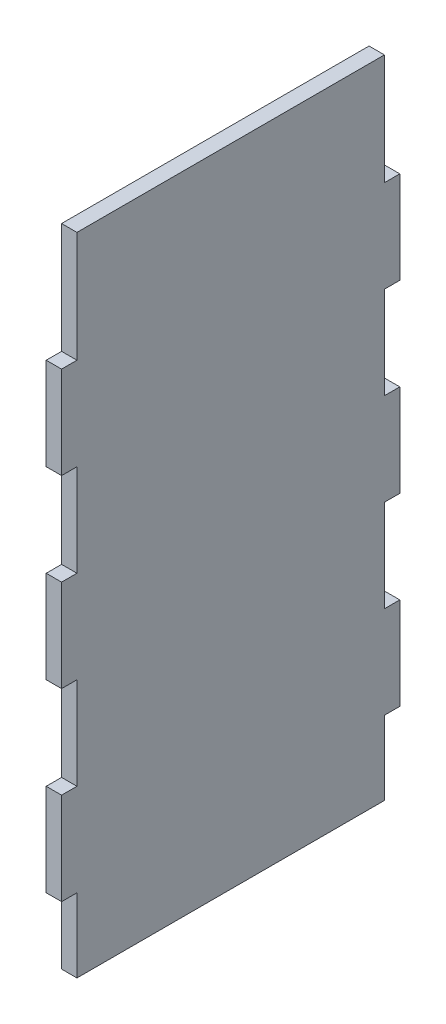
ISO-10303-21;
HEADER;
FILE_DESCRIPTION(('STEP AP214'),'2;1');
FILE_NAME('part.step','',(''),(''),'','','');
FILE_SCHEMA(('AUTOMOTIVE_DESIGN { 1 0 10303 214 1 1 1 1 }'));
ENDSEC;
DATA;
#1=APPLICATION_CONTEXT('core data for automotive mechanical design processes');
#2=APPLICATION_PROTOCOL_DEFINITION('international standard','automotive_design',2000,#1);
#3=PRODUCT_CONTEXT('',#1,'mechanical');
#4=PRODUCT('Part','Part','',(#3));
#5=PRODUCT_RELATED_PRODUCT_CATEGORY('part','',(#4));
#6=PRODUCT_DEFINITION_FORMATION('','',#4);
#7=PRODUCT_DEFINITION_CONTEXT('part definition',#1,'design');
#8=PRODUCT_DEFINITION('design','',#6,#7);
#9=PRODUCT_DEFINITION_SHAPE('','',#8);
#10=(LENGTH_UNIT() NAMED_UNIT(*) SI_UNIT(.MILLI.,.METRE.));
#11=(NAMED_UNIT(*) PLANE_ANGLE_UNIT() SI_UNIT($,.RADIAN.));
#12=(NAMED_UNIT(*) SI_UNIT($,.STERADIAN.) SOLID_ANGLE_UNIT());
#13=UNCERTAINTY_MEASURE_WITH_UNIT(LENGTH_MEASURE(1.E-05),#10,'distance_accuracy_value','');
#14=(GEOMETRIC_REPRESENTATION_CONTEXT(3) GLOBAL_UNCERTAINTY_ASSIGNED_CONTEXT((#13)) GLOBAL_UNIT_ASSIGNED_CONTEXT((#10,
#11,#12)) REPRESENTATION_CONTEXT('',''));
#15=CARTESIAN_POINT('',(0.,0.,0.));
#16=DIRECTION('',(0.,0.,1.));
#17=DIRECTION('',(1.,0.,0.));
#18=AXIS2_PLACEMENT_3D('',#15,#16,#17);
#19=CARTESIAN_POINT('',(3.175,0.,0.));
#20=DIRECTION('',(0.,0.,1.));
#21=DIRECTION('',(0.,-1.,0.));
#22=AXIS2_PLACEMENT_3D('',#19,#20,#21);
#23=PLANE('',#22);
#24=DIRECTION('',(0.,1.,0.));
#25=VECTOR('',#24,1.);
#26=CARTESIAN_POINT('',(0.,0.,0.));
#27=LINE('',#26,#25);
#28=CARTESIAN_POINT('',(0.,0.,0.));
#29=VERTEX_POINT('',#28);
#30=CARTESIAN_POINT('',(0.,15.24,-7.9815263405954E-13));
#31=VERTEX_POINT('',#30);
#32=EDGE_CURVE('E249',#29,#31,#27,.T.);
#33=ORIENTED_EDGE('',*,*,#32,.T.);
#34=DIRECTION('',(-1.,0.,0.));
#35=VECTOR('',#34,1.);
#36=CARTESIAN_POINT('',(3.175,15.24,-7.9815263405954E-13));
#37=LINE('',#36,#35);
#38=CARTESIAN_POINT('',(3.175,15.24,-7.9815263405954E-13));
#39=VERTEX_POINT('',#38);
#40=EDGE_CURVE('E11',#39,#31,#37,.T.);
#41=ORIENTED_EDGE('',*,*,#40,.F.);
#42=DIRECTION('',(0.,1.,0.));
#43=VECTOR('',#42,1.);
#44=CARTESIAN_POINT('',(3.175,0.,0.));
#45=LINE('',#44,#43);
#46=CARTESIAN_POINT('',(3.175,0.,0.));
#47=VERTEX_POINT('',#46);
#48=EDGE_CURVE('E303',#47,#39,#45,.T.);
#49=ORIENTED_EDGE('',*,*,#48,.F.);
#50=DIRECTION('',(-1.,0.,0.));
#51=VECTOR('',#50,1.);
#52=CARTESIAN_POINT('',(3.175,0.,0.));
#53=LINE('',#52,#51);
#54=EDGE_CURVE('E245',#47,#29,#53,.T.);
#55=ORIENTED_EDGE('',*,*,#54,.T.);
#56=EDGE_LOOP('',(#33,#41,#49,#55));
#57=FACE_BOUND('',#56,.T.);
#58=ADVANCED_FACE('F33',(#57),#23,.F.);
#59=CARTESIAN_POINT('',(3.175,15.24,-3.1750000000008));
#60=DIRECTION('',(0.,1.,0.));
#61=DIRECTION('',(0.,0.,1.));
#62=AXIS2_PLACEMENT_3D('',#59,#60,#61);
#63=PLANE('',#62);
#64=DIRECTION('',(0.,0.,-1.));
#65=VECTOR('',#64,1.);
#66=CARTESIAN_POINT('',(0.,15.24,-3.1750000000008));
#67=LINE('',#66,#65);
#68=CARTESIAN_POINT('',(0.,15.24,-3.1750000000008));
#69=VERTEX_POINT('',#68);
#70=EDGE_CURVE('E252',#31,#69,#67,.T.);
#71=ORIENTED_EDGE('',*,*,#70,.T.);
#72=DIRECTION('',(-1.,0.,0.));
#73=VECTOR('',#72,1.);
#74=CARTESIAN_POINT('',(3.175,15.24,-3.1750000000008));
#75=LINE('',#74,#73);
#76=CARTESIAN_POINT('',(3.175,15.24,-3.1750000000008));
#77=VERTEX_POINT('',#76);
#78=EDGE_CURVE('E41',#77,#69,#75,.T.);
#79=ORIENTED_EDGE('',*,*,#78,.F.);
#80=DIRECTION('',(0.,0.,-1.));
#81=VECTOR('',#80,1.);
#82=CARTESIAN_POINT('',(3.175,15.24,-3.1750000000008));
#83=LINE('',#82,#81);
#84=EDGE_CURVE('E152',#39,#77,#83,.T.);
#85=ORIENTED_EDGE('',*,*,#84,.F.);
#86=ORIENTED_EDGE('',*,*,#40,.T.);
#87=EDGE_LOOP('',(#71,#79,#85,#86));
#88=FACE_BOUND('',#87,.T.);
#89=ADVANCED_FACE('F461',(#88),#63,.F.);
#90=CARTESIAN_POINT('',(3.175,34.29,-3.1750000000008));
#91=DIRECTION('',(0.,0.,1.));
#92=DIRECTION('',(0.,-1.,0.));
#93=AXIS2_PLACEMENT_3D('',#90,#91,#92);
#94=PLANE('',#93);
#95=DIRECTION('',(0.,1.,0.));
#96=VECTOR('',#95,1.);
#97=CARTESIAN_POINT('',(0.,34.29,-3.1750000000008));
#98=LINE('',#97,#96);
#99=CARTESIAN_POINT('',(0.,34.29,-3.1750000000008));
#100=VERTEX_POINT('',#99);
#101=EDGE_CURVE('E254',#69,#100,#98,.T.);
#102=ORIENTED_EDGE('',*,*,#101,.T.);
#103=DIRECTION('',(-1.,0.,0.));
#104=VECTOR('',#103,1.);
#105=CARTESIAN_POINT('',(3.175,34.29,-3.1750000000008));
#106=LINE('',#105,#104);
#107=CARTESIAN_POINT('',(3.175,34.29,-3.1750000000008));
#108=VERTEX_POINT('',#107);
#109=EDGE_CURVE('E370',#108,#100,#106,.T.);
#110=ORIENTED_EDGE('',*,*,#109,.F.);
#111=DIRECTION('',(0.,1.,0.));
#112=VECTOR('',#111,1.);
#113=CARTESIAN_POINT('',(3.175,34.29,-3.1750000000008));
#114=LINE('',#113,#112);
#115=EDGE_CURVE('E378',#77,#108,#114,.T.);
#116=ORIENTED_EDGE('',*,*,#115,.F.);
#117=ORIENTED_EDGE('',*,*,#78,.T.);
#118=EDGE_LOOP('',(#102,#110,#116,#117));
#119=FACE_BOUND('',#118,.T.);
#120=ADVANCED_FACE('F376',(#119),#94,.F.);
#121=CARTESIAN_POINT('',(3.175,34.29,-7.9815263405954E-13));
#122=DIRECTION('',(0.,-1.,0.));
#123=DIRECTION('',(0.,0.,-1.));
#124=AXIS2_PLACEMENT_3D('',#121,#122,#123);
#125=PLANE('',#124);
#126=DIRECTION('',(0.,0.,1.));
#127=VECTOR('',#126,1.);
#128=CARTESIAN_POINT('',(0.,34.29,-7.9815263405954E-13));
#129=LINE('',#128,#127);
#130=CARTESIAN_POINT('',(0.,34.29,-7.9815263405954E-13));
#131=VERTEX_POINT('',#130);
#132=EDGE_CURVE('E256',#100,#131,#129,.T.);
#133=ORIENTED_EDGE('',*,*,#132,.T.);
#134=DIRECTION('',(-1.,0.,0.));
#135=VECTOR('',#134,1.);
#136=CARTESIAN_POINT('',(3.175,34.29,-7.9815263405954E-13));
#137=LINE('',#136,#135);
#138=CARTESIAN_POINT('',(3.175,34.29,-7.9815263405954E-13));
#139=VERTEX_POINT('',#138);
#140=EDGE_CURVE('E367',#139,#131,#137,.T.);
#141=ORIENTED_EDGE('',*,*,#140,.F.);
#142=DIRECTION('',(0.,0.,1.));
#143=VECTOR('',#142,1.);
#144=CARTESIAN_POINT('',(3.175,34.29,-7.9815263405954E-13));
#145=LINE('',#144,#143);
#146=EDGE_CURVE('E396',#108,#139,#145,.T.);
#147=ORIENTED_EDGE('',*,*,#146,.F.);
#148=ORIENTED_EDGE('',*,*,#109,.T.);
#149=EDGE_LOOP('',(#133,#141,#147,#148));
#150=FACE_BOUND('',#149,.T.);
#151=ADVANCED_FACE('F387',(#150),#125,.F.);
#152=CARTESIAN_POINT('',(3.175,34.29,-7.9815263405954E-13));
#153=DIRECTION('',(0.,0.,1.));
#154=DIRECTION('',(0.,-1.,0.));
#155=AXIS2_PLACEMENT_3D('',#152,#153,#154);
#156=PLANE('',#155);
#157=DIRECTION('',(0.,1.,0.));
#158=VECTOR('',#157,1.);
#159=CARTESIAN_POINT('',(0.,34.29,-7.9815263405954E-13));
#160=LINE('',#159,#158);
#161=CARTESIAN_POINT('',(0.,53.34,-3.9907631702977E-13));
#162=VERTEX_POINT('',#161);
#163=EDGE_CURVE('E258',#131,#162,#160,.T.);
#164=ORIENTED_EDGE('',*,*,#163,.T.);
#165=DIRECTION('',(-1.,0.,0.));
#166=VECTOR('',#165,1.);
#167=CARTESIAN_POINT('',(3.175,53.34,-3.9907631702977E-13));
#168=LINE('',#167,#166);
#169=CARTESIAN_POINT('',(3.175,53.34,-3.9907631702977E-13));
#170=VERTEX_POINT('',#169);
#171=EDGE_CURVE('E364',#170,#162,#168,.T.);
#172=ORIENTED_EDGE('',*,*,#171,.F.);
#173=DIRECTION('',(0.,1.,0.));
#174=VECTOR('',#173,1.);
#175=CARTESIAN_POINT('',(3.175,34.29,-7.9815263405954E-13));
#176=LINE('',#175,#174);
#177=EDGE_CURVE('E393',#139,#170,#176,.T.);
#178=ORIENTED_EDGE('',*,*,#177,.F.);
#179=ORIENTED_EDGE('',*,*,#140,.T.);
#180=EDGE_LOOP('',(#164,#172,#178,#179));
#181=FACE_BOUND('',#180,.T.);
#182=ADVANCED_FACE('F391',(#181),#156,.F.);
#183=CARTESIAN_POINT('',(3.175,53.34,-3.1750000000004));
#184=DIRECTION('',(0.,1.,0.));
#185=DIRECTION('',(0.,0.,1.));
#186=AXIS2_PLACEMENT_3D('',#183,#184,#185);
#187=PLANE('',#186);
#188=DIRECTION('',(0.,0.,-1.));
#189=VECTOR('',#188,1.);
#190=CARTESIAN_POINT('',(0.,53.34,-3.1750000000004));
#191=LINE('',#190,#189);
#192=CARTESIAN_POINT('',(0.,53.34,-3.1750000000004));
#193=VERTEX_POINT('',#192);
#194=EDGE_CURVE('E260',#162,#193,#191,.T.);
#195=ORIENTED_EDGE('',*,*,#194,.T.);
#196=DIRECTION('',(-1.,0.,0.));
#197=VECTOR('',#196,1.);
#198=CARTESIAN_POINT('',(3.175,53.34,-3.1750000000004));
#199=LINE('',#198,#197);
#200=CARTESIAN_POINT('',(3.175,53.34,-3.1750000000004));
#201=VERTEX_POINT('',#200);
#202=EDGE_CURVE('E361',#201,#193,#199,.T.);
#203=ORIENTED_EDGE('',*,*,#202,.F.);
#204=DIRECTION('',(0.,0.,-1.));
#205=VECTOR('',#204,1.);
#206=CARTESIAN_POINT('',(3.175,53.34,-3.1750000000004));
#207=LINE('',#206,#205);
#208=EDGE_CURVE('E395',#170,#201,#207,.T.);
#209=ORIENTED_EDGE('',*,*,#208,.F.);
#210=ORIENTED_EDGE('',*,*,#171,.T.);
#211=EDGE_LOOP('',(#195,#203,#209,#210));
#212=FACE_BOUND('',#211,.T.);
#213=ADVANCED_FACE('F474',(#212),#187,.F.);
#214=CARTESIAN_POINT('',(3.175,72.39,-3.1750000000004));
#215=DIRECTION('',(0.,0.,1.));
#216=DIRECTION('',(0.,-1.,0.));
#217=AXIS2_PLACEMENT_3D('',#214,#215,#216);
#218=PLANE('',#217);
#219=DIRECTION('',(0.,1.,0.));
#220=VECTOR('',#219,1.);
#221=CARTESIAN_POINT('',(0.,72.39,-3.1750000000004));
#222=LINE('',#221,#220);
#223=CARTESIAN_POINT('',(0.,72.39,-3.1750000000004));
#224=VERTEX_POINT('',#223);
#225=EDGE_CURVE('E262',#193,#224,#222,.T.);
#226=ORIENTED_EDGE('',*,*,#225,.T.);
#227=DIRECTION('',(-1.,0.,0.));
#228=VECTOR('',#227,1.);
#229=CARTESIAN_POINT('',(3.175,72.39,-3.1750000000004));
#230=LINE('',#229,#228);
#231=CARTESIAN_POINT('',(3.175,72.39,-3.1750000000004));
#232=VERTEX_POINT('',#231);
#233=EDGE_CURVE('E358',#232,#224,#230,.T.);
#234=ORIENTED_EDGE('',*,*,#233,.F.);
#235=DIRECTION('',(0.,1.,0.));
#236=VECTOR('',#235,1.);
#237=CARTESIAN_POINT('',(3.175,72.39,-3.1750000000004));
#238=LINE('',#237,#236);
#239=EDGE_CURVE('E398',#201,#232,#238,.T.);
#240=ORIENTED_EDGE('',*,*,#239,.F.);
#241=ORIENTED_EDGE('',*,*,#202,.T.);
#242=EDGE_LOOP('',(#226,#234,#240,#241));
#243=FACE_BOUND('',#242,.T.);
#244=ADVANCED_FACE('F477',(#243),#218,.F.);
#245=CARTESIAN_POINT('',(3.175,72.39,-3.9907631702977E-13));
#246=DIRECTION('',(0.,-1.,0.));
#247=DIRECTION('',(0.,0.,-1.));
#248=AXIS2_PLACEMENT_3D('',#245,#246,#247);
#249=PLANE('',#248);
#250=DIRECTION('',(0.,0.,1.));
#251=VECTOR('',#250,1.);
#252=CARTESIAN_POINT('',(0.,72.39,-3.9907631702977E-13));
#253=LINE('',#252,#251);
#254=CARTESIAN_POINT('',(0.,72.39,-3.9907631702977E-13));
#255=VERTEX_POINT('',#254);
#256=EDGE_CURVE('E264',#224,#255,#253,.T.);
#257=ORIENTED_EDGE('',*,*,#256,.T.);
#258=DIRECTION('',(-1.,0.,0.));
#259=VECTOR('',#258,1.);
#260=CARTESIAN_POINT('',(3.175,72.39,-3.9907631702977E-13));
#261=LINE('',#260,#259);
#262=CARTESIAN_POINT('',(3.175,72.39,-3.9907631702977E-13));
#263=VERTEX_POINT('',#262);
#264=EDGE_CURVE('E355',#263,#255,#261,.T.);
#265=ORIENTED_EDGE('',*,*,#264,.F.);
#266=DIRECTION('',(0.,0.,1.));
#267=VECTOR('',#266,1.);
#268=CARTESIAN_POINT('',(3.175,72.39,-3.9907631702977E-13));
#269=LINE('',#268,#267);
#270=EDGE_CURVE('E404',#232,#263,#269,.T.);
#271=ORIENTED_EDGE('',*,*,#270,.F.);
#272=ORIENTED_EDGE('',*,*,#233,.T.);
#273=EDGE_LOOP('',(#257,#265,#271,#272));
#274=FACE_BOUND('',#273,.T.);
#275=ADVANCED_FACE('F481',(#274),#249,.F.);
#276=CARTESIAN_POINT('',(3.175,72.39,-3.9907631702977E-13));
#277=DIRECTION('',(0.,0.,1.));
#278=DIRECTION('',(0.,-1.,0.));
#279=AXIS2_PLACEMENT_3D('',#276,#277,#278);
#280=PLANE('',#279);
#281=DIRECTION('',(0.,1.,0.));
#282=VECTOR('',#281,1.);
#283=CARTESIAN_POINT('',(0.,72.39,-3.9907631702977E-13));
#284=LINE('',#283,#282);
#285=CARTESIAN_POINT('',(0.,91.44,0.));
#286=VERTEX_POINT('',#285);
#287=EDGE_CURVE('E266',#255,#286,#284,.T.);
#288=ORIENTED_EDGE('',*,*,#287,.T.);
#289=DIRECTION('',(-1.,0.,0.));
#290=VECTOR('',#289,1.);
#291=CARTESIAN_POINT('',(3.175,91.44,0.));
#292=LINE('',#291,#290);
#293=CARTESIAN_POINT('',(3.175,91.44,0.));
#294=VERTEX_POINT('',#293);
#295=EDGE_CURVE('E352',#294,#286,#292,.T.);
#296=ORIENTED_EDGE('',*,*,#295,.F.);
#297=DIRECTION('',(0.,1.,0.));
#298=VECTOR('',#297,1.);
#299=CARTESIAN_POINT('',(3.175,72.39,-3.9907631702977E-13));
#300=LINE('',#299,#298);
#301=EDGE_CURVE('E406',#263,#294,#300,.T.);
#302=ORIENTED_EDGE('',*,*,#301,.F.);
#303=ORIENTED_EDGE('',*,*,#264,.T.);
#304=EDGE_LOOP('',(#288,#296,#302,#303));
#305=FACE_BOUND('',#304,.T.);
#306=ADVANCED_FACE('F485',(#305),#280,.F.);
#307=CARTESIAN_POINT('',(3.175,91.44,-3.175));
#308=DIRECTION('',(0.,1.,0.));
#309=DIRECTION('',(0.,0.,1.));
#310=AXIS2_PLACEMENT_3D('',#307,#308,#309);
#311=PLANE('',#310);
#312=DIRECTION('',(0.,0.,-1.));
#313=VECTOR('',#312,1.);
#314=CARTESIAN_POINT('',(0.,91.44,-3.175));
#315=LINE('',#314,#313);
#316=CARTESIAN_POINT('',(0.,91.44,-3.175));
#317=VERTEX_POINT('',#316);
#318=EDGE_CURVE('E268',#286,#317,#315,.T.);
#319=ORIENTED_EDGE('',*,*,#318,.T.);
#320=DIRECTION('',(-1.,0.,0.));
#321=VECTOR('',#320,1.);
#322=CARTESIAN_POINT('',(3.175,91.44,-3.175));
#323=LINE('',#322,#321);
#324=CARTESIAN_POINT('',(3.175,91.44,-3.175));
#325=VERTEX_POINT('',#324);
#326=EDGE_CURVE('E349',#325,#317,#323,.T.);
#327=ORIENTED_EDGE('',*,*,#326,.F.);
#328=DIRECTION('',(0.,0.,-1.));
#329=VECTOR('',#328,1.);
#330=CARTESIAN_POINT('',(3.175,91.44,-3.175));
#331=LINE('',#330,#329);
#332=EDGE_CURVE('E408',#294,#325,#331,.T.);
#333=ORIENTED_EDGE('',*,*,#332,.F.);
#334=ORIENTED_EDGE('',*,*,#295,.T.);
#335=EDGE_LOOP('',(#319,#327,#333,#334));
#336=FACE_BOUND('',#335,.T.);
#337=ADVANCED_FACE('F489',(#336),#311,.F.);
#338=CARTESIAN_POINT('',(3.175,110.49,-3.175));
#339=DIRECTION('',(0.,0.,1.));
#340=DIRECTION('',(0.,-1.,0.));
#341=AXIS2_PLACEMENT_3D('',#338,#339,#340);
#342=PLANE('',#341);
#343=DIRECTION('',(0.,1.,0.));
#344=VECTOR('',#343,1.);
#345=CARTESIAN_POINT('',(0.,110.49,-3.175));
#346=LINE('',#345,#344);
#347=CARTESIAN_POINT('',(0.,110.49,-3.175));
#348=VERTEX_POINT('',#347);
#349=EDGE_CURVE('E270',#317,#348,#346,.T.);
#350=ORIENTED_EDGE('',*,*,#349,.T.);
#351=DIRECTION('',(-1.,0.,0.));
#352=VECTOR('',#351,1.);
#353=CARTESIAN_POINT('',(3.175,110.49,-3.175));
#354=LINE('',#353,#352);
#355=CARTESIAN_POINT('',(3.175,110.49,-3.175));
#356=VERTEX_POINT('',#355);
#357=EDGE_CURVE('E346',#356,#348,#354,.T.);
#358=ORIENTED_EDGE('',*,*,#357,.F.);
#359=DIRECTION('',(0.,1.,0.));
#360=VECTOR('',#359,1.);
#361=CARTESIAN_POINT('',(3.175,110.49,-3.175));
#362=LINE('',#361,#360);
#363=EDGE_CURVE('E410',#325,#356,#362,.T.);
#364=ORIENTED_EDGE('',*,*,#363,.F.);
#365=ORIENTED_EDGE('',*,*,#326,.T.);
#366=EDGE_LOOP('',(#350,#358,#364,#365));
#367=FACE_BOUND('',#366,.T.);
#368=ADVANCED_FACE('F493',(#367),#342,.F.);
#369=CARTESIAN_POINT('',(3.175,110.49,0.));
#370=DIRECTION('',(0.,-1.,0.));
#371=DIRECTION('',(0.,0.,-1.));
#372=AXIS2_PLACEMENT_3D('',#369,#370,#371);
#373=PLANE('',#372);
#374=DIRECTION('',(0.,0.,1.));
#375=VECTOR('',#374,1.);
#376=CARTESIAN_POINT('',(0.,110.49,0.));
#377=LINE('',#376,#375);
#378=CARTESIAN_POINT('',(0.,110.49,0.));
#379=VERTEX_POINT('',#378);
#380=EDGE_CURVE('E272',#348,#379,#377,.T.);
#381=ORIENTED_EDGE('',*,*,#380,.T.);
#382=DIRECTION('',(-1.,0.,0.));
#383=VECTOR('',#382,1.);
#384=CARTESIAN_POINT('',(3.175,110.49,0.));
#385=LINE('',#384,#383);
#386=CARTESIAN_POINT('',(3.175,110.49,0.));
#387=VERTEX_POINT('',#386);
#388=EDGE_CURVE('E343',#387,#379,#385,.T.);
#389=ORIENTED_EDGE('',*,*,#388,.F.);
#390=DIRECTION('',(0.,0.,1.));
#391=VECTOR('',#390,1.);
#392=CARTESIAN_POINT('',(3.175,110.49,0.));
#393=LINE('',#392,#391);
#394=EDGE_CURVE('E412',#356,#387,#393,.T.);
#395=ORIENTED_EDGE('',*,*,#394,.F.);
#396=ORIENTED_EDGE('',*,*,#357,.T.);
#397=EDGE_LOOP('',(#381,#389,#395,#396));
#398=FACE_BOUND('',#397,.T.);
#399=ADVANCED_FACE('F497',(#398),#373,.F.);
#400=CARTESIAN_POINT('',(3.175,110.49,0.));
#401=DIRECTION('',(0.,0.,1.));
#402=DIRECTION('',(1.,0.,0.));
#403=AXIS2_PLACEMENT_3D('',#400,#401,#402);
#404=PLANE('',#403);
#405=DIRECTION('',(0.,1.,0.));
#406=VECTOR('',#405,1.);
#407=CARTESIAN_POINT('',(0.,110.49,0.));
#408=LINE('',#407,#406);
#409=CARTESIAN_POINT('',(0.,133.35,0.));
#410=VERTEX_POINT('',#409);
#411=EDGE_CURVE('E274',#379,#410,#408,.T.);
#412=ORIENTED_EDGE('',*,*,#411,.T.);
#413=DIRECTION('',(-1.,0.,0.));
#414=VECTOR('',#413,1.);
#415=CARTESIAN_POINT('',(3.175,133.35,0.));
#416=LINE('',#415,#414);
#417=CARTESIAN_POINT('',(3.175,133.35,0.));
#418=VERTEX_POINT('',#417);
#419=EDGE_CURVE('E340',#418,#410,#416,.T.);
#420=ORIENTED_EDGE('',*,*,#419,.F.);
#421=DIRECTION('',(0.,1.,0.));
#422=VECTOR('',#421,1.);
#423=CARTESIAN_POINT('',(3.175,110.49,0.));
#424=LINE('',#423,#422);
#425=EDGE_CURVE('E414',#387,#418,#424,.T.);
#426=ORIENTED_EDGE('',*,*,#425,.F.);
#427=ORIENTED_EDGE('',*,*,#388,.T.);
#428=EDGE_LOOP('',(#412,#420,#426,#427));
#429=FACE_BOUND('',#428,.T.);
#430=ADVANCED_FACE('F501',(#429),#404,.F.);
#431=CARTESIAN_POINT('',(3.175,133.35,0.));
#432=DIRECTION('',(0.,-1.,0.));
#433=DIRECTION('',(0.,0.,-1.));
#434=AXIS2_PLACEMENT_3D('',#431,#432,#433);
#435=PLANE('',#434);
#436=DIRECTION('',(0.,0.,1.));
#437=VECTOR('',#436,1.);
#438=CARTESIAN_POINT('',(0.,133.35,0.));
#439=LINE('',#438,#437);
#440=CARTESIAN_POINT('',(0.,133.35,63.5));
#441=VERTEX_POINT('',#440);
#442=EDGE_CURVE('E276',#410,#441,#439,.T.);
#443=ORIENTED_EDGE('',*,*,#442,.T.);
#444=DIRECTION('',(-1.,0.,0.));
#445=VECTOR('',#444,1.);
#446=CARTESIAN_POINT('',(3.175,133.35,63.5));
#447=LINE('',#446,#445);
#448=CARTESIAN_POINT('',(3.175,133.35,63.5));
#449=VERTEX_POINT('',#448);
#450=EDGE_CURVE('E337',#449,#441,#447,.T.);
#451=ORIENTED_EDGE('',*,*,#450,.F.);
#452=DIRECTION('',(0.,0.,1.));
#453=VECTOR('',#452,1.);
#454=CARTESIAN_POINT('',(3.175,133.35,0.));
#455=LINE('',#454,#453);
#456=EDGE_CURVE('E416',#418,#449,#455,.T.);
#457=ORIENTED_EDGE('',*,*,#456,.F.);
#458=ORIENTED_EDGE('',*,*,#419,.T.);
#459=EDGE_LOOP('',(#443,#451,#457,#458));
#460=FACE_BOUND('',#459,.T.);
#461=ADVANCED_FACE('F505',(#460),#435,.F.);
#462=CARTESIAN_POINT('',(3.175,110.49,63.5));
#463=DIRECTION('',(0.,0.,-1.));
#464=DIRECTION('',(-1.,0.,0.));
#465=AXIS2_PLACEMENT_3D('',#462,#463,#464);
#466=PLANE('',#465);
#467=DIRECTION('',(0.,-1.,0.));
#468=VECTOR('',#467,1.);
#469=CARTESIAN_POINT('',(0.,110.49,63.5));
#470=LINE('',#469,#468);
#471=CARTESIAN_POINT('',(0.,110.49,63.5));
#472=VERTEX_POINT('',#471);
#473=EDGE_CURVE('E278',#441,#472,#470,.T.);
#474=ORIENTED_EDGE('',*,*,#473,.T.);
#475=DIRECTION('',(-1.,0.,0.));
#476=VECTOR('',#475,1.);
#477=CARTESIAN_POINT('',(3.175,110.49,63.5));
#478=LINE('',#477,#476);
#479=CARTESIAN_POINT('',(3.175,110.49,63.5));
#480=VERTEX_POINT('',#479);
#481=EDGE_CURVE('E334',#480,#472,#478,.T.);
#482=ORIENTED_EDGE('',*,*,#481,.F.);
#483=DIRECTION('',(0.,-1.,0.));
#484=VECTOR('',#483,1.);
#485=CARTESIAN_POINT('',(3.175,110.49,63.5));
#486=LINE('',#485,#484);
#487=EDGE_CURVE('E418',#449,#480,#486,.T.);
#488=ORIENTED_EDGE('',*,*,#487,.F.);
#489=ORIENTED_EDGE('',*,*,#450,.T.);
#490=EDGE_LOOP('',(#474,#482,#488,#489));
#491=FACE_BOUND('',#490,.T.);
#492=ADVANCED_FACE('F509',(#491),#466,.F.);
#493=CARTESIAN_POINT('',(3.175,110.49,63.5));
#494=DIRECTION('',(0.,-1.,0.));
#495=DIRECTION('',(0.,0.,-1.));
#496=AXIS2_PLACEMENT_3D('',#493,#494,#495);
#497=PLANE('',#496);
#498=DIRECTION('',(0.,0.,1.));
#499=VECTOR('',#498,1.);
#500=CARTESIAN_POINT('',(0.,110.49,63.5));
#501=LINE('',#500,#499);
#502=CARTESIAN_POINT('',(0.,110.49,66.675));
#503=VERTEX_POINT('',#502);
#504=EDGE_CURVE('E280',#472,#503,#501,.T.);
#505=ORIENTED_EDGE('',*,*,#504,.T.);
#506=DIRECTION('',(-1.,0.,0.));
#507=VECTOR('',#506,1.);
#508=CARTESIAN_POINT('',(3.175,110.49,66.675));
#509=LINE('',#508,#507);
#510=CARTESIAN_POINT('',(3.175,110.49,66.675));
#511=VERTEX_POINT('',#510);
#512=EDGE_CURVE('E331',#511,#503,#509,.T.);
#513=ORIENTED_EDGE('',*,*,#512,.F.);
#514=DIRECTION('',(0.,0.,1.));
#515=VECTOR('',#514,1.);
#516=CARTESIAN_POINT('',(3.175,110.49,63.5));
#517=LINE('',#516,#515);
#518=EDGE_CURVE('E420',#480,#511,#517,.T.);
#519=ORIENTED_EDGE('',*,*,#518,.F.);
#520=ORIENTED_EDGE('',*,*,#481,.T.);
#521=EDGE_LOOP('',(#505,#513,#519,#520));
#522=FACE_BOUND('',#521,.T.);
#523=ADVANCED_FACE('F513',(#522),#497,.F.);
#524=CARTESIAN_POINT('',(3.175,110.49,66.675));
#525=DIRECTION('',(0.,0.,-1.));
#526=DIRECTION('',(-1.,0.,0.));
#527=AXIS2_PLACEMENT_3D('',#524,#525,#526);
#528=PLANE('',#527);
#529=DIRECTION('',(0.,-1.,0.));
#530=VECTOR('',#529,1.);
#531=CARTESIAN_POINT('',(0.,110.49,66.675));
#532=LINE('',#531,#530);
#533=CARTESIAN_POINT('',(0.,91.44,66.675));
#534=VERTEX_POINT('',#533);
#535=EDGE_CURVE('E282',#503,#534,#532,.T.);
#536=ORIENTED_EDGE('',*,*,#535,.T.);
#537=DIRECTION('',(-1.,0.,0.));
#538=VECTOR('',#537,1.);
#539=CARTESIAN_POINT('',(3.175,91.44,66.675));
#540=LINE('',#539,#538);
#541=CARTESIAN_POINT('',(3.175,91.44,66.675));
#542=VERTEX_POINT('',#541);
#543=EDGE_CURVE('E328',#542,#534,#540,.T.);
#544=ORIENTED_EDGE('',*,*,#543,.F.);
#545=DIRECTION('',(0.,-1.,0.));
#546=VECTOR('',#545,1.);
#547=CARTESIAN_POINT('',(3.175,110.49,66.675));
#548=LINE('',#547,#546);
#549=EDGE_CURVE('E422',#511,#542,#548,.T.);
#550=ORIENTED_EDGE('',*,*,#549,.F.);
#551=ORIENTED_EDGE('',*,*,#512,.T.);
#552=EDGE_LOOP('',(#536,#544,#550,#551));
#553=FACE_BOUND('',#552,.T.);
#554=ADVANCED_FACE('F517',(#553),#528,.F.);
#555=CARTESIAN_POINT('',(3.175,91.44,66.675));
#556=DIRECTION('',(0.,1.,0.));
#557=DIRECTION('',(0.,0.,1.));
#558=AXIS2_PLACEMENT_3D('',#555,#556,#557);
#559=PLANE('',#558);
#560=DIRECTION('',(0.,0.,-1.));
#561=VECTOR('',#560,1.);
#562=CARTESIAN_POINT('',(0.,91.44,66.675));
#563=LINE('',#562,#561);
#564=CARTESIAN_POINT('',(0.,91.44,63.5));
#565=VERTEX_POINT('',#564);
#566=EDGE_CURVE('E284',#534,#565,#563,.T.);
#567=ORIENTED_EDGE('',*,*,#566,.T.);
#568=DIRECTION('',(-1.,0.,0.));
#569=VECTOR('',#568,1.);
#570=CARTESIAN_POINT('',(3.175,91.44,63.5));
#571=LINE('',#570,#569);
#572=CARTESIAN_POINT('',(3.175,91.44,63.5));
#573=VERTEX_POINT('',#572);
#574=EDGE_CURVE('E325',#573,#565,#571,.T.);
#575=ORIENTED_EDGE('',*,*,#574,.F.);
#576=DIRECTION('',(0.,0.,-1.));
#577=VECTOR('',#576,1.);
#578=CARTESIAN_POINT('',(3.175,91.44,66.675));
#579=LINE('',#578,#577);
#580=EDGE_CURVE('E424',#542,#573,#579,.T.);
#581=ORIENTED_EDGE('',*,*,#580,.F.);
#582=ORIENTED_EDGE('',*,*,#543,.T.);
#583=EDGE_LOOP('',(#567,#575,#581,#582));
#584=FACE_BOUND('',#583,.T.);
#585=ADVANCED_FACE('F521',(#584),#559,.F.);
#586=CARTESIAN_POINT('',(3.175,72.39,63.5000000000004));
#587=DIRECTION('',(0.,0.,-1.));
#588=DIRECTION('',(0.,1.,0.));
#589=AXIS2_PLACEMENT_3D('',#586,#587,#588);
#590=PLANE('',#589);
#591=DIRECTION('',(0.,-1.,0.));
#592=VECTOR('',#591,1.);
#593=CARTESIAN_POINT('',(0.,72.39,63.5000000000004));
#594=LINE('',#593,#592);
#595=CARTESIAN_POINT('',(0.,72.39,63.5000000000004));
#596=VERTEX_POINT('',#595);
#597=EDGE_CURVE('E286',#565,#596,#594,.T.);
#598=ORIENTED_EDGE('',*,*,#597,.T.);
#599=DIRECTION('',(-1.,0.,0.));
#600=VECTOR('',#599,1.);
#601=CARTESIAN_POINT('',(3.175,72.39,63.5000000000004));
#602=LINE('',#601,#600);
#603=CARTESIAN_POINT('',(3.175,72.39,63.5000000000004));
#604=VERTEX_POINT('',#603);
#605=EDGE_CURVE('E322',#604,#596,#602,.T.);
#606=ORIENTED_EDGE('',*,*,#605,.F.);
#607=DIRECTION('',(0.,-1.,0.));
#608=VECTOR('',#607,1.);
#609=CARTESIAN_POINT('',(3.175,72.39,63.5000000000004));
#610=LINE('',#609,#608);
#611=EDGE_CURVE('E426',#573,#604,#610,.T.);
#612=ORIENTED_EDGE('',*,*,#611,.F.);
#613=ORIENTED_EDGE('',*,*,#574,.T.);
#614=EDGE_LOOP('',(#598,#606,#612,#613));
#615=FACE_BOUND('',#614,.T.);
#616=ADVANCED_FACE('F525',(#615),#590,.F.);
#617=CARTESIAN_POINT('',(3.175,72.39,63.5000000000004));
#618=DIRECTION('',(0.,-1.,0.));
#619=DIRECTION('',(0.,0.,-1.));
#620=AXIS2_PLACEMENT_3D('',#617,#618,#619);
#621=PLANE('',#620);
#622=DIRECTION('',(0.,0.,1.));
#623=VECTOR('',#622,1.);
#624=CARTESIAN_POINT('',(0.,72.39,63.5000000000004));
#625=LINE('',#624,#623);
#626=CARTESIAN_POINT('',(0.,72.39,66.6750000000004));
#627=VERTEX_POINT('',#626);
#628=EDGE_CURVE('E288',#596,#627,#625,.T.);
#629=ORIENTED_EDGE('',*,*,#628,.T.);
#630=DIRECTION('',(-1.,0.,0.));
#631=VECTOR('',#630,1.);
#632=CARTESIAN_POINT('',(3.175,72.39,66.6750000000004));
#633=LINE('',#632,#631);
#634=CARTESIAN_POINT('',(3.175,72.39,66.6750000000004));
#635=VERTEX_POINT('',#634);
#636=EDGE_CURVE('E319',#635,#627,#633,.T.);
#637=ORIENTED_EDGE('',*,*,#636,.F.);
#638=DIRECTION('',(0.,0.,1.));
#639=VECTOR('',#638,1.);
#640=CARTESIAN_POINT('',(3.175,72.39,63.5000000000004));
#641=LINE('',#640,#639);
#642=EDGE_CURVE('E428',#604,#635,#641,.T.);
#643=ORIENTED_EDGE('',*,*,#642,.F.);
#644=ORIENTED_EDGE('',*,*,#605,.T.);
#645=EDGE_LOOP('',(#629,#637,#643,#644));
#646=FACE_BOUND('',#645,.T.);
#647=ADVANCED_FACE('F529',(#646),#621,.F.);
#648=CARTESIAN_POINT('',(3.175,72.39,66.6750000000004));
#649=DIRECTION('',(0.,0.,-1.));
#650=DIRECTION('',(-1.,0.,0.));
#651=AXIS2_PLACEMENT_3D('',#648,#649,#650);
#652=PLANE('',#651);
#653=DIRECTION('',(0.,-1.,0.));
#654=VECTOR('',#653,1.);
#655=CARTESIAN_POINT('',(0.,72.39,66.6750000000004));
#656=LINE('',#655,#654);
#657=CARTESIAN_POINT('',(0.,53.34,66.6750000000004));
#658=VERTEX_POINT('',#657);
#659=EDGE_CURVE('E290',#627,#658,#656,.T.);
#660=ORIENTED_EDGE('',*,*,#659,.T.);
#661=DIRECTION('',(-1.,0.,0.));
#662=VECTOR('',#661,1.);
#663=CARTESIAN_POINT('',(3.175,53.34,66.6750000000004));
#664=LINE('',#663,#662);
#665=CARTESIAN_POINT('',(3.175,53.34,66.6750000000004));
#666=VERTEX_POINT('',#665);
#667=EDGE_CURVE('E316',#666,#658,#664,.T.);
#668=ORIENTED_EDGE('',*,*,#667,.F.);
#669=DIRECTION('',(0.,-1.,0.));
#670=VECTOR('',#669,1.);
#671=CARTESIAN_POINT('',(3.175,72.39,66.6750000000004));
#672=LINE('',#671,#670);
#673=EDGE_CURVE('E430',#635,#666,#672,.T.);
#674=ORIENTED_EDGE('',*,*,#673,.F.);
#675=ORIENTED_EDGE('',*,*,#636,.T.);
#676=EDGE_LOOP('',(#660,#668,#674,#675));
#677=FACE_BOUND('',#676,.T.);
#678=ADVANCED_FACE('F533',(#677),#652,.F.);
#679=CARTESIAN_POINT('',(3.175,53.34,66.6750000000004));
#680=DIRECTION('',(0.,1.,0.));
#681=DIRECTION('',(0.,0.,1.));
#682=AXIS2_PLACEMENT_3D('',#679,#680,#681);
#683=PLANE('',#682);
#684=DIRECTION('',(0.,0.,-1.));
#685=VECTOR('',#684,1.);
#686=CARTESIAN_POINT('',(0.,53.34,66.6750000000004));
#687=LINE('',#686,#685);
#688=CARTESIAN_POINT('',(0.,53.34,63.5000000000004));
#689=VERTEX_POINT('',#688);
#690=EDGE_CURVE('E292',#658,#689,#687,.T.);
#691=ORIENTED_EDGE('',*,*,#690,.T.);
#692=DIRECTION('',(-1.,0.,0.));
#693=VECTOR('',#692,1.);
#694=CARTESIAN_POINT('',(3.175,53.34,63.5000000000004));
#695=LINE('',#694,#693);
#696=CARTESIAN_POINT('',(3.175,53.34,63.5000000000004));
#697=VERTEX_POINT('',#696);
#698=EDGE_CURVE('E313',#697,#689,#695,.T.);
#699=ORIENTED_EDGE('',*,*,#698,.F.);
#700=DIRECTION('',(0.,0.,-1.));
#701=VECTOR('',#700,1.);
#702=CARTESIAN_POINT('',(3.175,53.34,66.6750000000004));
#703=LINE('',#702,#701);
#704=EDGE_CURVE('E432',#666,#697,#703,.T.);
#705=ORIENTED_EDGE('',*,*,#704,.F.);
#706=ORIENTED_EDGE('',*,*,#667,.T.);
#707=EDGE_LOOP('',(#691,#699,#705,#706));
#708=FACE_BOUND('',#707,.T.);
#709=ADVANCED_FACE('F537',(#708),#683,.F.);
#710=CARTESIAN_POINT('',(3.175,34.29,63.5000000000008));
#711=DIRECTION('',(0.,0.,-1.));
#712=DIRECTION('',(0.,1.,0.));
#713=AXIS2_PLACEMENT_3D('',#710,#711,#712);
#714=PLANE('',#713);
#715=DIRECTION('',(0.,-1.,0.));
#716=VECTOR('',#715,1.);
#717=CARTESIAN_POINT('',(0.,34.29,63.5000000000008));
#718=LINE('',#717,#716);
#719=CARTESIAN_POINT('',(0.,34.29,63.5000000000008));
#720=VERTEX_POINT('',#719);
#721=EDGE_CURVE('E294',#689,#720,#718,.T.);
#722=ORIENTED_EDGE('',*,*,#721,.T.);
#723=DIRECTION('',(-1.,0.,0.));
#724=VECTOR('',#723,1.);
#725=CARTESIAN_POINT('',(3.175,34.29,63.5000000000008));
#726=LINE('',#725,#724);
#727=CARTESIAN_POINT('',(3.175,34.29,63.5000000000008));
#728=VERTEX_POINT('',#727);
#729=EDGE_CURVE('E310',#728,#720,#726,.T.);
#730=ORIENTED_EDGE('',*,*,#729,.F.);
#731=DIRECTION('',(0.,-1.,0.));
#732=VECTOR('',#731,1.);
#733=CARTESIAN_POINT('',(3.175,34.29,63.5000000000008));
#734=LINE('',#733,#732);
#735=EDGE_CURVE('E434',#697,#728,#734,.T.);
#736=ORIENTED_EDGE('',*,*,#735,.F.);
#737=ORIENTED_EDGE('',*,*,#698,.T.);
#738=EDGE_LOOP('',(#722,#730,#736,#737));
#739=FACE_BOUND('',#738,.T.);
#740=ADVANCED_FACE('F541',(#739),#714,.F.);
#741=CARTESIAN_POINT('',(3.175,34.29,63.5000000000008));
#742=DIRECTION('',(0.,-1.,0.));
#743=DIRECTION('',(0.,0.,-1.));
#744=AXIS2_PLACEMENT_3D('',#741,#742,#743);
#745=PLANE('',#744);
#746=DIRECTION('',(0.,0.,1.));
#747=VECTOR('',#746,1.);
#748=CARTESIAN_POINT('',(0.,34.29,63.5000000000008));
#749=LINE('',#748,#747);
#750=CARTESIAN_POINT('',(0.,34.29,66.6750000000008));
#751=VERTEX_POINT('',#750);
#752=EDGE_CURVE('E296',#720,#751,#749,.T.);
#753=ORIENTED_EDGE('',*,*,#752,.T.);
#754=DIRECTION('',(-1.,0.,0.));
#755=VECTOR('',#754,1.);
#756=CARTESIAN_POINT('',(3.175,34.29,66.6750000000008));
#757=LINE('',#756,#755);
#758=CARTESIAN_POINT('',(3.175,34.29,66.6750000000008));
#759=VERTEX_POINT('',#758);
#760=EDGE_CURVE('E307',#759,#751,#757,.T.);
#761=ORIENTED_EDGE('',*,*,#760,.F.);
#762=DIRECTION('',(0.,0.,1.));
#763=VECTOR('',#762,1.);
#764=CARTESIAN_POINT('',(3.175,34.29,63.5000000000008));
#765=LINE('',#764,#763);
#766=EDGE_CURVE('E436',#728,#759,#765,.T.);
#767=ORIENTED_EDGE('',*,*,#766,.F.);
#768=ORIENTED_EDGE('',*,*,#729,.T.);
#769=EDGE_LOOP('',(#753,#761,#767,#768));
#770=FACE_BOUND('',#769,.T.);
#771=ADVANCED_FACE('F442',(#770),#745,.F.);
#772=CARTESIAN_POINT('',(3.175,34.29,66.6750000000008));
#773=DIRECTION('',(0.,0.,-1.));
#774=DIRECTION('',(0.,1.,0.));
#775=AXIS2_PLACEMENT_3D('',#772,#773,#774);
#776=PLANE('',#775);
#777=DIRECTION('',(0.,-1.,0.));
#778=VECTOR('',#777,1.);
#779=CARTESIAN_POINT('',(0.,34.29,66.6750000000008));
#780=LINE('',#779,#778);
#781=CARTESIAN_POINT('',(0.,15.24,66.6750000000008));
#782=VERTEX_POINT('',#781);
#783=EDGE_CURVE('E298',#751,#782,#780,.T.);
#784=ORIENTED_EDGE('',*,*,#783,.T.);
#785=DIRECTION('',(-1.,0.,0.));
#786=VECTOR('',#785,1.);
#787=CARTESIAN_POINT('',(3.175,15.24,66.6750000000008));
#788=LINE('',#787,#786);
#789=CARTESIAN_POINT('',(3.175,15.24,66.6750000000008));
#790=VERTEX_POINT('',#789);
#791=EDGE_CURVE('E240',#790,#782,#788,.T.);
#792=ORIENTED_EDGE('',*,*,#791,.F.);
#793=DIRECTION('',(0.,-1.,0.));
#794=VECTOR('',#793,1.);
#795=CARTESIAN_POINT('',(3.175,34.29,66.6750000000008));
#796=LINE('',#795,#794);
#797=EDGE_CURVE('E231',#759,#790,#796,.T.);
#798=ORIENTED_EDGE('',*,*,#797,.F.);
#799=ORIENTED_EDGE('',*,*,#760,.T.);
#800=EDGE_LOOP('',(#784,#792,#798,#799));
#801=FACE_BOUND('',#800,.T.);
#802=ADVANCED_FACE('F446',(#801),#776,.F.);
#803=CARTESIAN_POINT('',(3.175,15.24,66.6750000000008));
#804=DIRECTION('',(0.,1.,0.));
#805=DIRECTION('',(0.,0.,1.));
#806=AXIS2_PLACEMENT_3D('',#803,#804,#805);
#807=PLANE('',#806);
#808=DIRECTION('',(0.,0.,-1.));
#809=VECTOR('',#808,1.);
#810=CARTESIAN_POINT('',(0.,15.24,66.6750000000008));
#811=LINE('',#810,#809);
#812=CARTESIAN_POINT('',(0.,15.24,63.5000000000008));
#813=VERTEX_POINT('',#812);
#814=EDGE_CURVE('E239',#782,#813,#811,.T.);
#815=ORIENTED_EDGE('',*,*,#814,.T.);
#816=DIRECTION('',(-1.,0.,0.));
#817=VECTOR('',#816,1.);
#818=CARTESIAN_POINT('',(3.175,15.24,63.5000000000008));
#819=LINE('',#818,#817);
#820=CARTESIAN_POINT('',(3.175,15.24,63.5000000000008));
#821=VERTEX_POINT('',#820);
#822=EDGE_CURVE('E236',#821,#813,#819,.T.);
#823=ORIENTED_EDGE('',*,*,#822,.F.);
#824=DIRECTION('',(0.,0.,-1.));
#825=VECTOR('',#824,1.);
#826=CARTESIAN_POINT('',(3.175,15.24,66.6750000000008));
#827=LINE('',#826,#825);
#828=EDGE_CURVE('E225',#790,#821,#827,.T.);
#829=ORIENTED_EDGE('',*,*,#828,.F.);
#830=ORIENTED_EDGE('',*,*,#791,.T.);
#831=EDGE_LOOP('',(#815,#823,#829,#830));
#832=FACE_BOUND('',#831,.T.);
#833=ADVANCED_FACE('F237',(#832),#807,.F.);
#834=CARTESIAN_POINT('',(3.175,0.,63.5));
#835=DIRECTION('',(0.,0.,-1.));
#836=DIRECTION('',(0.,1.,0.));
#837=AXIS2_PLACEMENT_3D('',#834,#835,#836);
#838=PLANE('',#837);
#839=DIRECTION('',(0.,-1.,0.));
#840=VECTOR('',#839,1.);
#841=CARTESIAN_POINT('',(0.,0.,63.5));
#842=LINE('',#841,#840);
#843=CARTESIAN_POINT('',(0.,0.,63.5));
#844=VERTEX_POINT('',#843);
#845=EDGE_CURVE('E138',#813,#844,#842,.T.);
#846=ORIENTED_EDGE('',*,*,#845,.T.);
#847=DIRECTION('',(-1.,0.,0.));
#848=VECTOR('',#847,1.);
#849=CARTESIAN_POINT('',(3.175,0.,63.5));
#850=LINE('',#849,#848);
#851=CARTESIAN_POINT('',(3.175,0.,63.5));
#852=VERTEX_POINT('',#851);
#853=EDGE_CURVE('E241',#852,#844,#850,.T.);
#854=ORIENTED_EDGE('',*,*,#853,.F.);
#855=DIRECTION('',(0.,-1.,0.));
#856=VECTOR('',#855,1.);
#857=CARTESIAN_POINT('',(3.175,0.,63.5));
#858=LINE('',#857,#856);
#859=EDGE_CURVE('E229',#821,#852,#858,.T.);
#860=ORIENTED_EDGE('',*,*,#859,.F.);
#861=ORIENTED_EDGE('',*,*,#822,.T.);
#862=EDGE_LOOP('',(#846,#854,#860,#861));
#863=FACE_BOUND('',#862,.T.);
#864=ADVANCED_FACE('F243',(#863),#838,.F.);
#865=CARTESIAN_POINT('',(3.175,0.,0.));
#866=DIRECTION('',(0.,1.,0.));
#867=DIRECTION('',(0.,0.,1.));
#868=AXIS2_PLACEMENT_3D('',#865,#866,#867);
#869=PLANE('',#868);
#870=DIRECTION('',(0.,0.,-1.));
#871=VECTOR('',#870,1.);
#872=CARTESIAN_POINT('',(0.,0.,0.));
#873=LINE('',#872,#871);
#874=EDGE_CURVE('E144',#844,#29,#873,.T.);
#875=ORIENTED_EDGE('',*,*,#874,.T.);
#876=ORIENTED_EDGE('',*,*,#54,.F.);
#877=DIRECTION('',(0.,0.,-1.));
#878=VECTOR('',#877,1.);
#879=CARTESIAN_POINT('',(3.175,0.,0.));
#880=LINE('',#879,#878);
#881=EDGE_CURVE('E49',#852,#47,#880,.T.);
#882=ORIENTED_EDGE('',*,*,#881,.F.);
#883=ORIENTED_EDGE('',*,*,#853,.T.);
#884=EDGE_LOOP('',(#875,#876,#882,#883));
#885=FACE_BOUND('',#884,.T.);
#886=ADVANCED_FACE('F450',(#885),#869,.F.);
#887=CARTESIAN_POINT('',(3.175,0.,0.));
#888=DIRECTION('',(1.,0.,0.));
#889=DIRECTION('',(0.,0.,-1.));
#890=AXIS2_PLACEMENT_3D('',#887,#888,#889);
#891=PLANE('',#890);
#892=ORIENTED_EDGE('',*,*,#48,.T.);
#893=ORIENTED_EDGE('',*,*,#84,.T.);
#894=ORIENTED_EDGE('',*,*,#115,.T.);
#895=ORIENTED_EDGE('',*,*,#146,.T.);
#896=ORIENTED_EDGE('',*,*,#177,.T.);
#897=ORIENTED_EDGE('',*,*,#208,.T.);
#898=ORIENTED_EDGE('',*,*,#239,.T.);
#899=ORIENTED_EDGE('',*,*,#270,.T.);
#900=ORIENTED_EDGE('',*,*,#301,.T.);
#901=ORIENTED_EDGE('',*,*,#332,.T.);
#902=ORIENTED_EDGE('',*,*,#363,.T.);
#903=ORIENTED_EDGE('',*,*,#394,.T.);
#904=ORIENTED_EDGE('',*,*,#425,.T.);
#905=ORIENTED_EDGE('',*,*,#456,.T.);
#906=ORIENTED_EDGE('',*,*,#487,.T.);
#907=ORIENTED_EDGE('',*,*,#518,.T.);
#908=ORIENTED_EDGE('',*,*,#549,.T.);
#909=ORIENTED_EDGE('',*,*,#580,.T.);
#910=ORIENTED_EDGE('',*,*,#611,.T.);
#911=ORIENTED_EDGE('',*,*,#642,.T.);
#912=ORIENTED_EDGE('',*,*,#673,.T.);
#913=ORIENTED_EDGE('',*,*,#704,.T.);
#914=ORIENTED_EDGE('',*,*,#735,.T.);
#915=ORIENTED_EDGE('',*,*,#766,.T.);
#916=ORIENTED_EDGE('',*,*,#797,.T.);
#917=ORIENTED_EDGE('',*,*,#828,.T.);
#918=ORIENTED_EDGE('',*,*,#859,.T.);
#919=ORIENTED_EDGE('',*,*,#881,.T.);
#920=EDGE_LOOP('',(#892,#893,#894,#895,#896,#897,#898,#899,#900,#901,#902,#903,#904,#905,#906,
#907,#908,#909,#910,#911,#912,#913,#914,#915,#916,#917,#918,#919));
#921=FACE_BOUND('',#920,.T.);
#922=ADVANCED_FACE('F227',(#921),#891,.T.);
#923=CARTESIAN_POINT('',(0.,0.,0.));
#924=DIRECTION('',(1.,0.,0.));
#925=DIRECTION('',(0.,0.,-1.));
#926=AXIS2_PLACEMENT_3D('',#923,#924,#925);
#927=PLANE('',#926);
#928=ORIENTED_EDGE('',*,*,#32,.F.);
#929=ORIENTED_EDGE('',*,*,#874,.F.);
#930=ORIENTED_EDGE('',*,*,#845,.F.);
#931=ORIENTED_EDGE('',*,*,#814,.F.);
#932=ORIENTED_EDGE('',*,*,#783,.F.);
#933=ORIENTED_EDGE('',*,*,#752,.F.);
#934=ORIENTED_EDGE('',*,*,#721,.F.);
#935=ORIENTED_EDGE('',*,*,#690,.F.);
#936=ORIENTED_EDGE('',*,*,#659,.F.);
#937=ORIENTED_EDGE('',*,*,#628,.F.);
#938=ORIENTED_EDGE('',*,*,#597,.F.);
#939=ORIENTED_EDGE('',*,*,#566,.F.);
#940=ORIENTED_EDGE('',*,*,#535,.F.);
#941=ORIENTED_EDGE('',*,*,#504,.F.);
#942=ORIENTED_EDGE('',*,*,#473,.F.);
#943=ORIENTED_EDGE('',*,*,#442,.F.);
#944=ORIENTED_EDGE('',*,*,#411,.F.);
#945=ORIENTED_EDGE('',*,*,#380,.F.);
#946=ORIENTED_EDGE('',*,*,#349,.F.);
#947=ORIENTED_EDGE('',*,*,#318,.F.);
#948=ORIENTED_EDGE('',*,*,#287,.F.);
#949=ORIENTED_EDGE('',*,*,#256,.F.);
#950=ORIENTED_EDGE('',*,*,#225,.F.);
#951=ORIENTED_EDGE('',*,*,#194,.F.);
#952=ORIENTED_EDGE('',*,*,#163,.F.);
#953=ORIENTED_EDGE('',*,*,#132,.F.);
#954=ORIENTED_EDGE('',*,*,#101,.F.);
#955=ORIENTED_EDGE('',*,*,#70,.F.);
#956=EDGE_LOOP('',(#928,#929,#930,#931,#932,#933,#934,#935,#936,#937,#938,#939,#940,#941,#942,
#943,#944,#945,#946,#947,#948,#949,#950,#951,#952,#953,#954,#955));
#957=FACE_BOUND('',#956,.T.);
#958=ADVANCED_FACE('F382',(#957),#927,.F.);
#959=CLOSED_SHELL('',(#58,#89,#120,#151,#182,#213,#244,#275,#306,#337,#368,#399,#430,#461,#492,
#523,#554,#585,#616,#647,#678,#709,#740,#771,#802,#833,#864,#886,#922,#958));
#960=MANIFOLD_SOLID_BREP('B2',#959);
#961=ADVANCED_BREP_SHAPE_REPRESENTATION('',(#18,#960),#14);
#962=SHAPE_DEFINITION_REPRESENTATION(#9,#961);
ENDSEC;
END-ISO-10303-21;
